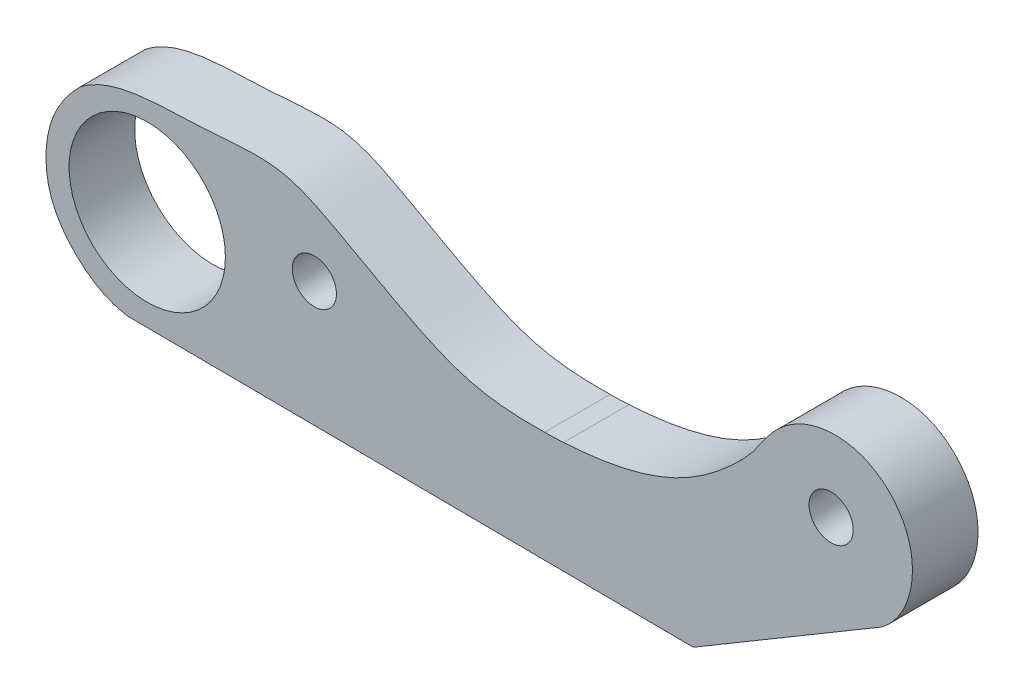
ISO-10303-21;
HEADER;
FILE_DESCRIPTION(('STEP AP214'),'2;1');
FILE_NAME('part.step','',(''),(''),'','','');
FILE_SCHEMA(('AUTOMOTIVE_DESIGN { 1 0 10303 214 1 1 1 1 }'));
ENDSEC;
DATA;
#1=APPLICATION_CONTEXT('core data for automotive mechanical design processes');
#2=APPLICATION_PROTOCOL_DEFINITION('international standard','automotive_design',2000,#1);
#3=PRODUCT_CONTEXT('',#1,'mechanical');
#4=PRODUCT('Part','Part','',(#3));
#5=PRODUCT_RELATED_PRODUCT_CATEGORY('part','',(#4));
#6=PRODUCT_DEFINITION_FORMATION('','',#4);
#7=PRODUCT_DEFINITION_CONTEXT('part definition',#1,'design');
#8=PRODUCT_DEFINITION('design','',#6,#7);
#9=PRODUCT_DEFINITION_SHAPE('','',#8);
#10=(LENGTH_UNIT() NAMED_UNIT(*) SI_UNIT(.MILLI.,.METRE.));
#11=(NAMED_UNIT(*) PLANE_ANGLE_UNIT() SI_UNIT($,.RADIAN.));
#12=(NAMED_UNIT(*) SI_UNIT($,.STERADIAN.) SOLID_ANGLE_UNIT());
#13=UNCERTAINTY_MEASURE_WITH_UNIT(LENGTH_MEASURE(1.E-05),#10,'distance_accuracy_value','');
#14=(GEOMETRIC_REPRESENTATION_CONTEXT(3) GLOBAL_UNCERTAINTY_ASSIGNED_CONTEXT((#13)) GLOBAL_UNIT_ASSIGNED_CONTEXT((#10,
#11,#12)) REPRESENTATION_CONTEXT('',''));
#15=CARTESIAN_POINT('',(0.,0.,0.));
#16=DIRECTION('',(0.,0.,1.));
#17=DIRECTION('',(1.,0.,0.));
#18=AXIS2_PLACEMENT_3D('',#15,#16,#17);
#19=CARTESIAN_POINT('',(-16.3651324524654,27.597237205665,5.05));
#20=DIRECTION('',(-0.510061044769221,0.860138204365398,0.));
#21=DIRECTION('',(-0.860138204365398,-0.510061044769221,0.));
#22=AXIS2_PLACEMENT_3D('',#19,#20,#21);
#23=PLANE('',#22);
#24=DIRECTION('',(0.860138204365398,0.510061044769221,0.));
#25=VECTOR('',#24,1.);
#26=CARTESIAN_POINT('',(-16.3651324524654,27.597237205665,0.));
#27=LINE('',#26,#25);
#28=CARTESIAN_POINT('',(-45.8065173750898,10.1385271089941,0.));
#29=VERTEX_POINT('',#28);
#30=CARTESIAN_POINT('',(-31.2793439312161,18.7531255848201,0.));
#31=VERTEX_POINT('',#30);
#32=EDGE_CURVE('E176',#29,#31,#27,.T.);
#33=ORIENTED_EDGE('',*,*,#32,.T.);
#34=DIRECTION('',(0.,0.,-1.));
#35=VECTOR('',#34,1.);
#36=CARTESIAN_POINT('',(-31.2793439312161,18.7531255848201,5.05));
#37=LINE('',#36,#35);
#38=CARTESIAN_POINT('',(-31.2793439312161,18.7531255848201,5.05));
#39=VERTEX_POINT('',#38);
#40=EDGE_CURVE('E11',#39,#31,#37,.T.);
#41=ORIENTED_EDGE('',*,*,#40,.F.);
#42=DIRECTION('',(0.860138204365398,0.510061044769221,0.));
#43=VECTOR('',#42,1.);
#44=CARTESIAN_POINT('',(-16.3651324524654,27.597237205665,5.05));
#45=LINE('',#44,#43);
#46=CARTESIAN_POINT('',(-45.8065173750898,10.1385271089941,5.05));
#47=VERTEX_POINT('',#46);
#48=EDGE_CURVE('E144',#47,#39,#45,.T.);
#49=ORIENTED_EDGE('',*,*,#48,.F.);
#50=DIRECTION('',(0.,0.,-1.));
#51=VECTOR('',#50,1.);
#52=CARTESIAN_POINT('',(-45.8065173750898,10.1385271089941,5.05));
#53=LINE('',#52,#51);
#54=EDGE_CURVE('E117',#47,#29,#53,.T.);
#55=ORIENTED_EDGE('',*,*,#54,.T.);
#56=EDGE_LOOP('',(#33,#41,#49,#55));
#57=FACE_BOUND('',#56,.T.);
#58=ADVANCED_FACE('F36',(#57),#23,.F.);
#59=CARTESIAN_POINT('',(-31.2793439312161,18.7531255848201,5.05));
#60=CARTESIAN_POINT('',(-29.0980433454653,20.4036510575763,5.05));
#61=CARTESIAN_POINT('',(-27.9050572559335,25.4416248334502,5.05));
#62=CARTESIAN_POINT('',(-32.3003840528742,29.8584116303143,5.05));
#63=CARTESIAN_POINT('',(-36.6905416729498,29.9188634459079,5.05));
#64=CARTESIAN_POINT('',(-39.6148928825368,27.9423766019697,5.05));
#65=CARTESIAN_POINT('',(-41.0324515703012,25.5521004310688,5.05));
#66=CARTESIAN_POINT('',(-43.2846404569285,23.2416386731387,5.05));
#67=CARTESIAN_POINT('',(-48.1487855967706,19.5714869035757,5.05));
#68=CARTESIAN_POINT('',(-55.4824330057747,18.5532288557096,5.05));
#69=CARTESIAN_POINT('',(-63.127762505071,18.8959739607833,5.05));
#70=CARTESIAN_POINT('',(-68.3011033102577,21.4574379799719,5.05));
#71=CARTESIAN_POINT('',(-72.9856177094147,24.0865685804208,5.05));
#72=CARTESIAN_POINT('',(-76.315266746424,25.8751284241934,5.05));
#73=CARTESIAN_POINT('',(-79.7395264028922,26.2367159767452,5.05));
#74=CARTESIAN_POINT('',(-83.2789287024221,25.7950018133173,5.05));
#75=CARTESIAN_POINT('',(-88.2388176781267,25.8484338999151,5.05));
#76=CARTESIAN_POINT('',(-91.6891719871941,24.9989539466543,5.05));
#77=CARTESIAN_POINT('',(-93.08374484262,23.8512105054544,5.05));
#78=B_SPLINE_CURVE_WITH_KNOTS('',3,(#59,#60,#61,#62,#63,#64,#65,#66,#67,#68,#69,#70,#71,#72,#73,
#74,#75,#76,#77),.UNSPECIFIED.,.F.,.F.,(4,1,1,1,1,1,1,1,1,1,1,1,1,1,1,1,4),(0.,
0.102244465290879,0.160154236261766,0.214292787390952,0.256272844332401,0.289149591331498,
0.319658417070902,0.379342085765607,0.518902230963491,0.590344576338759,0.669858141824343,
0.735080639407954,0.798411315906265,0.81036301693689,0.866325433613108,0.934003558728996,1.),.UNSPECIFIED.);
#79=DIRECTION('',(0.,0.,-1.));
#80=VECTOR('',#79,1.);
#81=SURFACE_OF_LINEAR_EXTRUSION('',#78,#80);
#82=CARTESIAN_POINT('',(-31.2793439312161,18.7531255848201,0.));
#83=CARTESIAN_POINT('',(-29.0980433454653,20.4036510575763,0.));
#84=CARTESIAN_POINT('',(-27.9050572559335,25.4416248334502,0.));
#85=CARTESIAN_POINT('',(-32.3003840528742,29.8584116303143,0.));
#86=CARTESIAN_POINT('',(-36.6905416729498,29.9188634459079,0.));
#87=CARTESIAN_POINT('',(-39.6148928825368,27.9423766019697,0.));
#88=CARTESIAN_POINT('',(-41.0324515703012,25.5521004310688,0.));
#89=CARTESIAN_POINT('',(-43.2846404569285,23.2416386731387,0.));
#90=CARTESIAN_POINT('',(-48.1487855967706,19.5714869035757,0.));
#91=CARTESIAN_POINT('',(-55.4824330057747,18.5532288557096,0.));
#92=CARTESIAN_POINT('',(-63.127762505071,18.8959739607833,0.));
#93=CARTESIAN_POINT('',(-68.3011033102577,21.4574379799719,0.));
#94=CARTESIAN_POINT('',(-72.9856177094147,24.0865685804208,0.));
#95=CARTESIAN_POINT('',(-76.315266746424,25.8751284241934,0.));
#96=CARTESIAN_POINT('',(-79.7395264028922,26.2367159767452,0.));
#97=CARTESIAN_POINT('',(-83.2789287024221,25.7950018133173,0.));
#98=CARTESIAN_POINT('',(-88.2388176781267,25.8484338999151,0.));
#99=CARTESIAN_POINT('',(-91.6891719871941,24.9989539466543,0.));
#100=CARTESIAN_POINT('',(-93.08374484262,23.8512105054544,0.));
#101=B_SPLINE_CURVE_WITH_KNOTS('',3,(#82,#83,#84,#85,#86,#87,#88,#89,#90,#91,#92,#93,#94,#95,
#96,#97,#98,#99,#100),.UNSPECIFIED.,.F.,.F.,(4,1,1,1,1,1,1,1,1,1,1,1,1,1,1,1,4),(0.,
0.102244465290879,0.160154236261766,0.214292787390952,0.256272844332401,0.289149591331498,
0.319658417070902,0.379342085765607,0.518902230963491,0.590344576338759,0.669858141824343,
0.735080639407954,0.798411315906265,0.81036301693689,0.866325433613108,0.934003558728996,1.),.UNSPECIFIED.);
#102=CARTESIAN_POINT('',(-55.8031549754555,18.8049533000138,0.));
#103=VERTEX_POINT('',#102);
#104=EDGE_CURVE('E174',#31,#103,#101,.T.);
#105=ORIENTED_EDGE('',*,*,#104,.T.);
#106=DIRECTION('',(0.,0.,-1.));
#107=VECTOR('',#106,1.);
#108=CARTESIAN_POINT('',(-55.8031549754555,18.8049533000138,5.05));
#109=LINE('',#108,#107);
#110=CARTESIAN_POINT('',(-55.8031549754555,18.8049533000138,5.05));
#111=VERTEX_POINT('',#110);
#112=EDGE_CURVE('E45',#111,#103,#109,.T.);
#113=ORIENTED_EDGE('',*,*,#112,.F.);
#114=EDGE_CURVE('E90',#39,#111,#78,.T.);
#115=ORIENTED_EDGE('',*,*,#114,.F.);
#116=ORIENTED_EDGE('',*,*,#40,.T.);
#117=EDGE_LOOP('',(#105,#113,#115,#116));
#118=FACE_BOUND('',#117,.T.);
#119=ADVANCED_FACE('F138',(#118),#81,.F.);
#120=CARTESIAN_POINT('',(-57.2562652498555,37.2981255848201,5.05));
#121=DIRECTION('',(0.,0.,-1.));
#122=DIRECTION('',(1.,0.,0.));
#123=AXIS2_PLACEMENT_3D('',#120,#121,#122);
#124=ELLIPSE('',#123,19.45,18.545);
#125=DIRECTION('',(0.,0.,-1.));
#126=VECTOR('',#125,1.);
#127=SURFACE_OF_LINEAR_EXTRUSION('',#124,#126);
#128=CARTESIAN_POINT('',(-57.2562652498555,37.2981255848201,0.));
#129=DIRECTION('',(0.,0.,-1.));
#130=DIRECTION('',(1.,0.,0.));
#131=AXIS2_PLACEMENT_3D('',#128,#129,#130);
#132=ELLIPSE('',#131,19.45,18.545);
#133=CARTESIAN_POINT('',(-57.2562652498555,18.7531255848201,0.));
#134=VERTEX_POINT('',#133);
#135=EDGE_CURVE('E170',#103,#134,#132,.T.);
#136=ORIENTED_EDGE('',*,*,#135,.T.);
#137=DIRECTION('',(0.,0.,-1.));
#138=VECTOR('',#137,1.);
#139=CARTESIAN_POINT('',(-57.2562652498555,18.7531255848201,5.05));
#140=LINE('',#139,#138);
#141=CARTESIAN_POINT('',(-57.2562652498555,18.7531255848201,5.05));
#142=VERTEX_POINT('',#141);
#143=EDGE_CURVE('E112',#142,#134,#140,.T.);
#144=ORIENTED_EDGE('',*,*,#143,.F.);
#145=EDGE_CURVE('E103',#111,#142,#124,.T.);
#146=ORIENTED_EDGE('',*,*,#145,.F.);
#147=ORIENTED_EDGE('',*,*,#112,.T.);
#148=EDGE_LOOP('',(#136,#144,#146,#147));
#149=FACE_BOUND('',#148,.T.);
#150=ADVANCED_FACE('F137',(#149),#127,.F.);
#151=CARTESIAN_POINT('',(-93.0837448449973,23.8512105031248,0.));
#152=VERTEX_POINT('',#151);
#153=EDGE_CURVE('E111',#134,#152,#101,.T.);
#154=ORIENTED_EDGE('',*,*,#153,.T.);
#155=DIRECTION('',(0.,0.,-1.));
#156=VECTOR('',#155,1.);
#157=CARTESIAN_POINT('',(-93.0837448449973,23.8512105031248,5.05));
#158=LINE('',#157,#156);
#159=CARTESIAN_POINT('',(-93.0837448449973,23.8512105031248,5.05));
#160=VERTEX_POINT('',#159);
#161=EDGE_CURVE('E108',#160,#152,#158,.T.);
#162=ORIENTED_EDGE('',*,*,#161,.F.);
#163=EDGE_CURVE('E97',#142,#160,#78,.T.);
#164=ORIENTED_EDGE('',*,*,#163,.F.);
#165=ORIENTED_EDGE('',*,*,#143,.T.);
#166=EDGE_LOOP('',(#154,#162,#164,#165));
#167=FACE_BOUND('',#166,.T.);
#168=ADVANCED_FACE('F109',(#167),#81,.F.);
#169=CARTESIAN_POINT('',(-45.447999980637,61.2865055482563,5.05));
#170=CARTESIAN_POINT('',(-51.0278893524311,61.1688298874616,5.05));
#171=CARTESIAN_POINT('',(-58.9132499486092,61.1411652448543,5.05));
#172=CARTESIAN_POINT('',(-68.7052418490788,58.8464245541363,5.05));
#173=CARTESIAN_POINT('',(-73.7843710537458,57.3619765706734,5.05));
#174=CARTESIAN_POINT('',(-77.6463785103275,56.2101423912901,5.05));
#175=CARTESIAN_POINT('',(-79.6123367373129,54.116804133715,5.05));
#176=CARTESIAN_POINT('',(-79.7858667435209,51.8488401536115,5.05));
#177=CARTESIAN_POINT('',(-79.5708279834339,50.1208712476038,5.05));
#178=CARTESIAN_POINT('',(-79.8280626135216,48.25629506017,5.05));
#179=CARTESIAN_POINT('',(-80.6296893893469,45.9721549386007,5.05));
#180=CARTESIAN_POINT('',(-81.5739828186396,42.4408487868336,5.05));
#181=CARTESIAN_POINT('',(-82.9109358337757,38.1103981907808,5.05));
#182=CARTESIAN_POINT('',(-84.4849774979321,33.6587041259481,5.05));
#183=CARTESIAN_POINT('',(-86.9306982572566,29.5959467289524,5.05));
#184=CARTESIAN_POINT('',(-89.5527225726976,26.4319697976968,5.05));
#185=CARTESIAN_POINT('',(-93.1345185253551,24.1320199934935,5.05));
#186=CARTESIAN_POINT('',(-95.2267389963488,21.2515944528925,5.05));
#187=CARTESIAN_POINT('',(-95.8242461685684,18.047120823068,5.05));
#188=CARTESIAN_POINT('',(-95.4061739048649,15.1623586750247,5.05));
#189=CARTESIAN_POINT('',(-93.3152451644513,12.1482048617321,5.05));
#190=CARTESIAN_POINT('',(-91.0893353393591,10.6925559491149,5.05));
#191=CARTESIAN_POINT('',(-89.3748982137795,10.4439159602341,5.05));
#192=B_SPLINE_CURVE_WITH_KNOTS('',3,(#169,#170,#171,#172,#173,#174,#175,#176,#177,#178,#179,
#180,#181,#182,#183,#184,#185,#186,#187,#188,#189,#190,#191),.UNSPECIFIED.,.F.,.F.,(4,1,1,1,1,1,
1,1,1,1,1,1,1,1,1,1,1,1,1,1,4),(0.,0.193746416370488,0.269881459228766,0.346531711332351,
0.377650485050324,0.407609602951645,0.438994647159427,0.452450488875014,0.467917052642461,
0.503362358814784,0.536032459638258,0.594231527519269,0.66024296693297,0.69828626256234,
0.757936424635522,0.80003143357371,0.844688231520188,0.876032891927952,0.910905343274308,
0.942275003598052,1.),.UNSPECIFIED.);
#193=DIRECTION('',(0.,0.,-1.));
#194=VECTOR('',#193,1.);
#195=SURFACE_OF_LINEAR_EXTRUSION('',#192,#194);
#196=CARTESIAN_POINT('',(-45.447999980637,61.2865055482563,0.));
#197=CARTESIAN_POINT('',(-51.0278893524311,61.1688298874616,0.));
#198=CARTESIAN_POINT('',(-58.9132499486092,61.1411652448543,0.));
#199=CARTESIAN_POINT('',(-68.7052418490788,58.8464245541363,0.));
#200=CARTESIAN_POINT('',(-73.7843710537458,57.3619765706734,0.));
#201=CARTESIAN_POINT('',(-77.6463785103275,56.2101423912901,0.));
#202=CARTESIAN_POINT('',(-79.6123367373129,54.116804133715,0.));
#203=CARTESIAN_POINT('',(-79.7858667435209,51.8488401536115,0.));
#204=CARTESIAN_POINT('',(-79.5708279834339,50.1208712476038,0.));
#205=CARTESIAN_POINT('',(-79.8280626135216,48.25629506017,0.));
#206=CARTESIAN_POINT('',(-80.6296893893469,45.9721549386007,0.));
#207=CARTESIAN_POINT('',(-81.5739828186396,42.4408487868336,0.));
#208=CARTESIAN_POINT('',(-82.9109358337757,38.1103981907808,0.));
#209=CARTESIAN_POINT('',(-84.4849774979321,33.6587041259481,0.));
#210=CARTESIAN_POINT('',(-86.9306982572566,29.5959467289524,0.));
#211=CARTESIAN_POINT('',(-89.5527225726976,26.4319697976968,0.));
#212=CARTESIAN_POINT('',(-93.1345185253551,24.1320199934935,0.));
#213=CARTESIAN_POINT('',(-95.2267389963488,21.2515944528925,0.));
#214=CARTESIAN_POINT('',(-95.8242461685684,18.047120823068,0.));
#215=CARTESIAN_POINT('',(-95.4061739048649,15.1623586750247,0.));
#216=CARTESIAN_POINT('',(-93.3152451644513,12.1482048617321,0.));
#217=CARTESIAN_POINT('',(-91.0893353393591,10.6925559491149,0.));
#218=CARTESIAN_POINT('',(-89.3748982137795,10.4439159602341,0.));
#219=B_SPLINE_CURVE_WITH_KNOTS('',3,(#196,#197,#198,#199,#200,#201,#202,#203,#204,#205,#206,
#207,#208,#209,#210,#211,#212,#213,#214,#215,#216,#217,#218),.UNSPECIFIED.,.F.,.F.,(4,1,1,1,1,1,
1,1,1,1,1,1,1,1,1,1,1,1,1,1,4),(0.,0.193746416370488,0.269881459228766,0.346531711332351,
0.377650485050324,0.407609602951645,0.438994647159427,0.452450488875014,0.467917052642461,
0.503362358814784,0.536032459638258,0.594231527519269,0.66024296693297,0.69828626256234,
0.757936424635522,0.80003143357371,0.844688231520188,0.876032891927952,0.910905343274308,
0.942275003598052,1.),.UNSPECIFIED.);
#220=CARTESIAN_POINT('',(-89.3748982137796,10.4439159602341,0.));
#221=VERTEX_POINT('',#220);
#222=EDGE_CURVE('E76',#152,#221,#219,.T.);
#223=ORIENTED_EDGE('',*,*,#222,.T.);
#224=DIRECTION('',(0.,0.,-1.));
#225=VECTOR('',#224,1.);
#226=CARTESIAN_POINT('',(-89.3748982137796,10.4439159602341,5.05));
#227=LINE('',#226,#225);
#228=CARTESIAN_POINT('',(-89.3748982137796,10.4439159602341,5.05));
#229=VERTEX_POINT('',#228);
#230=EDGE_CURVE('E113',#229,#221,#227,.T.);
#231=ORIENTED_EDGE('',*,*,#230,.F.);
#232=EDGE_CURVE('E101',#160,#229,#192,.T.);
#233=ORIENTED_EDGE('',*,*,#232,.F.);
#234=ORIENTED_EDGE('',*,*,#161,.T.);
#235=EDGE_LOOP('',(#223,#231,#233,#234));
#236=FACE_BOUND('',#235,.T.);
#237=ADVANCED_FACE('F115',(#236),#195,.F.);
#238=CARTESIAN_POINT('',(-35.1890677699318,24.1135684786121,5.05));
#239=DIRECTION('',(0.,0.,-1.));
#240=DIRECTION('',(-1.,0.,0.));
#241=AXIS2_PLACEMENT_3D('',#238,#239,#240);
#242=CYLINDRICAL_SURFACE('',#241,1.7);
#243=CARTESIAN_POINT('',(-35.1890677699318,24.1135684786121,5.05));
#244=DIRECTION('',(0.,0.,1.));
#245=DIRECTION('',(1.,0.,0.));
#246=AXIS2_PLACEMENT_3D('',#243,#244,#245);
#247=CIRCLE('',#246,1.7);
#248=CARTESIAN_POINT('',(-33.4890677699318,24.1135684786121,5.05));
#249=VERTEX_POINT('',#248);
#250=EDGE_CURVE('E149',#249,#249,#247,.F.);
#251=ORIENTED_EDGE('',*,*,#250,.F.);
#252=EDGE_LOOP('',(#251));
#253=FACE_BOUND('',#252,.T.);
#254=CARTESIAN_POINT('',(-35.1890677699318,24.1135684786121,0.));
#255=DIRECTION('',(0.,0.,1.));
#256=DIRECTION('',(1.,0.,0.));
#257=AXIS2_PLACEMENT_3D('',#254,#255,#256);
#258=CIRCLE('',#257,1.7);
#259=CARTESIAN_POINT('',(-33.4890677699318,24.1135684786121,0.));
#260=VERTEX_POINT('',#259);
#261=EDGE_CURVE('E185',#260,#260,#258,.F.);
#262=ORIENTED_EDGE('',*,*,#261,.T.);
#263=EDGE_LOOP('',(#262));
#264=FACE_BOUND('',#263,.T.);
#265=ADVANCED_FACE('F132',(#253,#264),#242,.F.);
#266=CARTESIAN_POINT('',(-87.8666784734581,18.1393025940135,5.05));
#267=DIRECTION('',(0.,0.,-1.));
#268=DIRECTION('',(-1.,0.,0.));
#269=AXIS2_PLACEMENT_3D('',#266,#267,#268);
#270=CYLINDRICAL_SURFACE('',#269,6.02);
#271=CARTESIAN_POINT('',(-87.8666784734581,18.1393025940135,5.05));
#272=DIRECTION('',(0.,0.,1.));
#273=DIRECTION('',(1.,0.,0.));
#274=AXIS2_PLACEMENT_3D('',#271,#272,#273);
#275=CIRCLE('',#274,6.02);
#276=CARTESIAN_POINT('',(-81.8466784734581,18.1393025940135,5.05));
#277=VERTEX_POINT('',#276);
#278=EDGE_CURVE('E152',#277,#277,#275,.F.);
#279=ORIENTED_EDGE('',*,*,#278,.F.);
#280=EDGE_LOOP('',(#279));
#281=FACE_BOUND('',#280,.T.);
#282=CARTESIAN_POINT('',(-87.8666784734581,18.1393025940135,0.));
#283=DIRECTION('',(0.,0.,1.));
#284=DIRECTION('',(1.,0.,0.));
#285=AXIS2_PLACEMENT_3D('',#282,#283,#284);
#286=CIRCLE('',#285,6.02);
#287=CARTESIAN_POINT('',(-81.8466784734581,18.1393025940135,0.));
#288=VERTEX_POINT('',#287);
#289=EDGE_CURVE('E188',#288,#288,#286,.F.);
#290=ORIENTED_EDGE('',*,*,#289,.T.);
#291=EDGE_LOOP('',(#290));
#292=FACE_BOUND('',#291,.T.);
#293=ADVANCED_FACE('F202',(#281,#292),#270,.F.);
#294=CARTESIAN_POINT('',(-74.9935608009401,19.9565088478769,5.05));
#295=DIRECTION('',(0.,0.,-1.));
#296=DIRECTION('',(-1.,0.,0.));
#297=AXIS2_PLACEMENT_3D('',#294,#295,#296);
#298=CYLINDRICAL_SURFACE('',#297,1.7);
#299=CARTESIAN_POINT('',(-74.9935608009401,19.9565088478769,5.05));
#300=DIRECTION('',(0.,0.,1.));
#301=DIRECTION('',(1.,0.,0.));
#302=AXIS2_PLACEMENT_3D('',#299,#300,#301);
#303=CIRCLE('',#302,1.7);
#304=CARTESIAN_POINT('',(-73.2935608009402,19.9565088478769,5.05));
#305=VERTEX_POINT('',#304);
#306=EDGE_CURVE('E155',#305,#305,#303,.F.);
#307=ORIENTED_EDGE('',*,*,#306,.F.);
#308=EDGE_LOOP('',(#307));
#309=FACE_BOUND('',#308,.T.);
#310=CARTESIAN_POINT('',(-74.9935608009401,19.9565088478769,0.));
#311=DIRECTION('',(0.,0.,1.));
#312=DIRECTION('',(1.,0.,0.));
#313=AXIS2_PLACEMENT_3D('',#310,#311,#312);
#314=CIRCLE('',#313,1.7);
#315=CARTESIAN_POINT('',(-73.2935608009402,19.9565088478769,0.));
#316=VERTEX_POINT('',#315);
#317=EDGE_CURVE('E190',#316,#316,#314,.F.);
#318=ORIENTED_EDGE('',*,*,#317,.T.);
#319=EDGE_LOOP('',(#318));
#320=FACE_BOUND('',#319,.T.);
#321=ADVANCED_FACE('F38',(#309,#320),#298,.F.);
#322=CARTESIAN_POINT('',(0.0688111996184571,9.81696790426816,5.05));
#323=DIRECTION('',(0.00700924256241139,0.99997543495763,0.));
#324=DIRECTION('',(-0.99997543495763,0.00700924256241139,0.));
#325=AXIS2_PLACEMENT_3D('',#322,#323,#324);
#326=PLANE('',#325);
#327=DIRECTION('',(0.99997543495763,-0.00700924256241139,0.));
#328=VECTOR('',#327,1.);
#329=CARTESIAN_POINT('',(0.0688111996184571,9.81696790426816,0.));
#330=LINE('',#329,#328);
#331=EDGE_CURVE('E82',#221,#29,#330,.T.);
#332=ORIENTED_EDGE('',*,*,#331,.T.);
#333=ORIENTED_EDGE('',*,*,#54,.F.);
#334=DIRECTION('',(0.99997543495763,-0.00700924256241139,0.));
#335=VECTOR('',#334,1.);
#336=CARTESIAN_POINT('',(0.0688111996184571,9.81696790426816,5.05));
#337=LINE('',#336,#335);
#338=EDGE_CURVE('E53',#229,#47,#337,.T.);
#339=ORIENTED_EDGE('',*,*,#338,.F.);
#340=ORIENTED_EDGE('',*,*,#230,.T.);
#341=EDGE_LOOP('',(#332,#333,#339,#340));
#342=FACE_BOUND('',#341,.T.);
#343=ADVANCED_FACE('F133',(#342),#326,.F.);
#344=CARTESIAN_POINT('',(0.,0.,5.05));
#345=DIRECTION('',(0.,0.,1.));
#346=DIRECTION('',(1.,0.,0.));
#347=AXIS2_PLACEMENT_3D('',#344,#345,#346);
#348=PLANE('',#347);
#349=ORIENTED_EDGE('',*,*,#306,.T.);
#350=EDGE_LOOP('',(#349));
#351=FACE_BOUND('',#350,.T.);
#352=ORIENTED_EDGE('',*,*,#278,.T.);
#353=EDGE_LOOP('',(#352));
#354=FACE_BOUND('',#353,.T.);
#355=ORIENTED_EDGE('',*,*,#250,.T.);
#356=EDGE_LOOP('',(#355));
#357=FACE_BOUND('',#356,.T.);
#358=ORIENTED_EDGE('',*,*,#48,.T.);
#359=ORIENTED_EDGE('',*,*,#114,.T.);
#360=ORIENTED_EDGE('',*,*,#145,.T.);
#361=ORIENTED_EDGE('',*,*,#163,.T.);
#362=ORIENTED_EDGE('',*,*,#232,.T.);
#363=ORIENTED_EDGE('',*,*,#338,.T.);
#364=EDGE_LOOP('',(#358,#359,#360,#361,#362,#363));
#365=FACE_BOUND('',#364,.T.);
#366=ADVANCED_FACE('F99',(#351,#354,#357,#365),#348,.T.);
#367=CARTESIAN_POINT('',(0.,0.,0.));
#368=DIRECTION('',(0.,0.,1.));
#369=DIRECTION('',(1.,0.,0.));
#370=AXIS2_PLACEMENT_3D('',#367,#368,#369);
#371=PLANE('',#370);
#372=ORIENTED_EDGE('',*,*,#317,.F.);
#373=EDGE_LOOP('',(#372));
#374=FACE_BOUND('',#373,.T.);
#375=ORIENTED_EDGE('',*,*,#289,.F.);
#376=EDGE_LOOP('',(#375));
#377=FACE_BOUND('',#376,.T.);
#378=ORIENTED_EDGE('',*,*,#261,.F.);
#379=EDGE_LOOP('',(#378));
#380=FACE_BOUND('',#379,.T.);
#381=ORIENTED_EDGE('',*,*,#32,.F.);
#382=ORIENTED_EDGE('',*,*,#331,.F.);
#383=ORIENTED_EDGE('',*,*,#222,.F.);
#384=ORIENTED_EDGE('',*,*,#153,.F.);
#385=ORIENTED_EDGE('',*,*,#135,.F.);
#386=ORIENTED_EDGE('',*,*,#104,.F.);
#387=EDGE_LOOP('',(#381,#382,#383,#384,#385,#386));
#388=FACE_BOUND('',#387,.T.);
#389=ADVANCED_FACE('F173',(#374,#377,#380,#388),#371,.F.);
#390=CLOSED_SHELL('',(#58,#119,#150,#168,#237,#265,#293,#321,#343,#366,#389));
#391=MANIFOLD_SOLID_BREP('B2',#390);
#392=ADVANCED_BREP_SHAPE_REPRESENTATION('',(#18,#391),#14);
#393=SHAPE_DEFINITION_REPRESENTATION(#9,#392);
ENDSEC;
END-ISO-10303-21;
